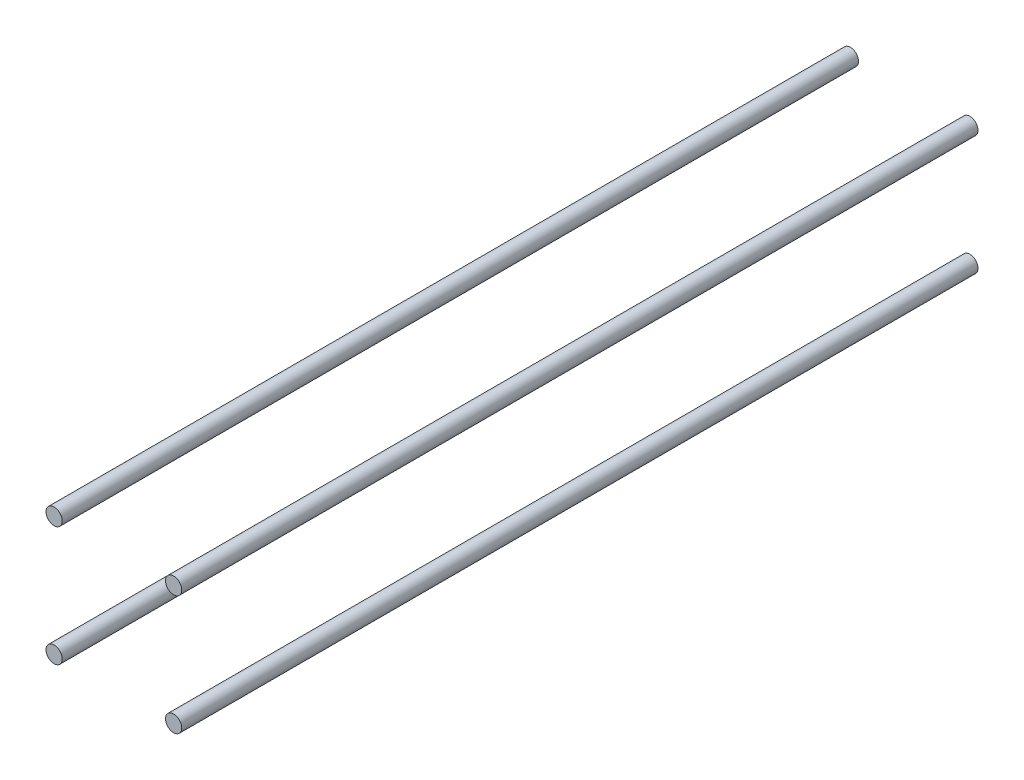
ISO-10303-21;
HEADER;
FILE_DESCRIPTION(('STEP AP214'),'2;1');
FILE_NAME('part.step','',(''),(''),'','','');
FILE_SCHEMA(('AUTOMOTIVE_DESIGN { 1 0 10303 214 1 1 1 1 }'));
ENDSEC;
DATA;
#1=APPLICATION_CONTEXT('core data for automotive mechanical design processes');
#2=APPLICATION_PROTOCOL_DEFINITION('international standard','automotive_design',2000,#1);
#3=PRODUCT_CONTEXT('',#1,'mechanical');
#4=PRODUCT('Part','Part','',(#3));
#5=PRODUCT_RELATED_PRODUCT_CATEGORY('part','',(#4));
#6=PRODUCT_DEFINITION_FORMATION('','',#4);
#7=PRODUCT_DEFINITION_CONTEXT('part definition',#1,'design');
#8=PRODUCT_DEFINITION('design','',#6,#7);
#9=PRODUCT_DEFINITION_SHAPE('','',#8);
#10=(LENGTH_UNIT() NAMED_UNIT(*) SI_UNIT(.MILLI.,.METRE.));
#11=(NAMED_UNIT(*) PLANE_ANGLE_UNIT() SI_UNIT($,.RADIAN.));
#12=(NAMED_UNIT(*) SI_UNIT($,.STERADIAN.) SOLID_ANGLE_UNIT());
#13=UNCERTAINTY_MEASURE_WITH_UNIT(LENGTH_MEASURE(1.E-05),#10,'distance_accuracy_value','');
#14=(GEOMETRIC_REPRESENTATION_CONTEXT(3) GLOBAL_UNCERTAINTY_ASSIGNED_CONTEXT((#13)) GLOBAL_UNIT_ASSIGNED_CONTEXT((#10,
#11,#12)) REPRESENTATION_CONTEXT('',''));
#15=CARTESIAN_POINT('',(0.,0.,0.));
#16=DIRECTION('',(0.,0.,1.));
#17=DIRECTION('',(1.,0.,0.));
#18=AXIS2_PLACEMENT_3D('',#15,#16,#17);
#19=CARTESIAN_POINT('',(-18.383354245955,18.3833542459555,245.));
#20=DIRECTION('',(0.,0.,-1.));
#21=DIRECTION('',(-1.,0.,0.));
#22=AXIS2_PLACEMENT_3D('',#19,#20,#21);
#23=CYLINDRICAL_SURFACE('',#22,2.5);
#24=CARTESIAN_POINT('',(-18.383354245955,18.3833542459555,245.));
#25=DIRECTION('',(0.,0.,1.));
#26=DIRECTION('',(1.,0.,0.));
#27=AXIS2_PLACEMENT_3D('',#24,#25,#26);
#28=CIRCLE('',#27,2.5);
#29=CARTESIAN_POINT('',(-15.883354245955,18.3833542459555,245.));
#30=VERTEX_POINT('',#29);
#31=EDGE_CURVE('E11',#30,#30,#28,.T.);
#32=ORIENTED_EDGE('',*,*,#31,.F.);
#33=EDGE_LOOP('',(#32));
#34=FACE_BOUND('',#33,.T.);
#35=CARTESIAN_POINT('',(-18.383354245955,18.3833542459555,0.));
#36=DIRECTION('',(0.,0.,1.));
#37=DIRECTION('',(1.,0.,0.));
#38=AXIS2_PLACEMENT_3D('',#35,#36,#37);
#39=CIRCLE('',#38,2.5);
#40=CARTESIAN_POINT('',(-15.883354245955,18.3833542459555,0.));
#41=VERTEX_POINT('',#40);
#42=EDGE_CURVE('E40',#41,#41,#39,.T.);
#43=ORIENTED_EDGE('',*,*,#42,.T.);
#44=EDGE_LOOP('',(#43));
#45=FACE_BOUND('',#44,.T.);
#46=ADVANCED_FACE('F37',(#34,#45),#23,.T.);
#47=CARTESIAN_POINT('',(-18.383354245955,18.3833542459555,245.));
#48=DIRECTION('',(0.,0.,1.));
#49=DIRECTION('',(1.,0.,0.));
#50=AXIS2_PLACEMENT_3D('',#47,#48,#49);
#51=PLANE('',#50);
#52=ORIENTED_EDGE('',*,*,#31,.T.);
#53=EDGE_LOOP('',(#52));
#54=FACE_BOUND('',#53,.T.);
#55=ADVANCED_FACE('F52',(#54),#51,.T.);
#56=CARTESIAN_POINT('',(-18.383354245955,18.3833542459555,0.));
#57=DIRECTION('',(0.,0.,1.));
#58=DIRECTION('',(1.,0.,0.));
#59=AXIS2_PLACEMENT_3D('',#56,#57,#58);
#60=PLANE('',#59);
#61=ORIENTED_EDGE('',*,*,#42,.F.);
#62=EDGE_LOOP('',(#61));
#63=FACE_BOUND('',#62,.T.);
#64=ADVANCED_FACE('F50',(#63),#60,.F.);
#65=CLOSED_SHELL('',(#46,#55,#64));
#66=MANIFOLD_SOLID_BREP('B2',#65);
#67=CARTESIAN_POINT('',(-18.3833542459554,-18.3833542459551,245.));
#68=DIRECTION('',(0.,0.,-1.));
#69=DIRECTION('',(-1.,0.,0.));
#70=AXIS2_PLACEMENT_3D('',#67,#68,#69);
#71=CYLINDRICAL_SURFACE('',#70,2.5);
#72=CARTESIAN_POINT('',(-18.3833542459554,-18.3833542459551,245.));
#73=DIRECTION('',(0.,0.,1.));
#74=DIRECTION('',(1.,0.,0.));
#75=AXIS2_PLACEMENT_3D('',#72,#73,#74);
#76=CIRCLE('',#75,2.5);
#77=CARTESIAN_POINT('',(-15.8833542459554,-18.3833542459551,245.));
#78=VERTEX_POINT('',#77);
#79=EDGE_CURVE('E36',#78,#78,#76,.T.);
#80=ORIENTED_EDGE('',*,*,#79,.F.);
#81=EDGE_LOOP('',(#80));
#82=FACE_BOUND('',#81,.T.);
#83=CARTESIAN_POINT('',(-18.3833542459554,-18.3833542459551,0.));
#84=DIRECTION('',(0.,0.,1.));
#85=DIRECTION('',(1.,0.,0.));
#86=AXIS2_PLACEMENT_3D('',#83,#84,#85);
#87=CIRCLE('',#86,2.5);
#88=CARTESIAN_POINT('',(-15.8833542459554,-18.3833542459551,0.));
#89=VERTEX_POINT('',#88);
#90=EDGE_CURVE('E88',#89,#89,#87,.T.);
#91=ORIENTED_EDGE('',*,*,#90,.T.);
#92=EDGE_LOOP('',(#91));
#93=FACE_BOUND('',#92,.T.);
#94=ADVANCED_FACE('F85',(#82,#93),#71,.T.);
#95=CARTESIAN_POINT('',(-18.3833542459554,-18.3833542459551,245.));
#96=DIRECTION('',(0.,0.,1.));
#97=DIRECTION('',(1.,0.,0.));
#98=AXIS2_PLACEMENT_3D('',#95,#96,#97);
#99=PLANE('',#98);
#100=ORIENTED_EDGE('',*,*,#79,.T.);
#101=EDGE_LOOP('',(#100));
#102=FACE_BOUND('',#101,.T.);
#103=ADVANCED_FACE('F100',(#102),#99,.T.);
#104=CARTESIAN_POINT('',(-18.3833542459554,-18.3833542459551,0.));
#105=DIRECTION('',(0.,0.,1.));
#106=DIRECTION('',(1.,0.,0.));
#107=AXIS2_PLACEMENT_3D('',#104,#105,#106);
#108=PLANE('',#107);
#109=ORIENTED_EDGE('',*,*,#90,.F.);
#110=EDGE_LOOP('',(#109));
#111=FACE_BOUND('',#110,.T.);
#112=ADVANCED_FACE('F98',(#111),#108,.F.);
#113=CLOSED_SHELL('',(#94,#103,#112));
#114=MANIFOLD_SOLID_BREP('B6',#113);
#115=CARTESIAN_POINT('',(18.3833542459552,-18.3833542459554,245.));
#116=DIRECTION('',(0.,0.,-1.));
#117=DIRECTION('',(-1.,0.,0.));
#118=AXIS2_PLACEMENT_3D('',#115,#116,#117);
#119=CYLINDRICAL_SURFACE('',#118,2.5);
#120=CARTESIAN_POINT('',(18.3833542459552,-18.3833542459554,245.));
#121=DIRECTION('',(0.,0.,1.));
#122=DIRECTION('',(1.,0.,0.));
#123=AXIS2_PLACEMENT_3D('',#120,#121,#122);
#124=CIRCLE('',#123,2.5);
#125=CARTESIAN_POINT('',(20.8833542459552,-18.3833542459554,245.));
#126=VERTEX_POINT('',#125);
#127=EDGE_CURVE('E84',#126,#126,#124,.T.);
#128=ORIENTED_EDGE('',*,*,#127,.F.);
#129=EDGE_LOOP('',(#128));
#130=FACE_BOUND('',#129,.T.);
#131=CARTESIAN_POINT('',(18.3833542459552,-18.3833542459554,0.));
#132=DIRECTION('',(0.,0.,1.));
#133=DIRECTION('',(1.,0.,0.));
#134=AXIS2_PLACEMENT_3D('',#131,#132,#133);
#135=CIRCLE('',#134,2.5);
#136=CARTESIAN_POINT('',(20.8833542459552,-18.3833542459554,0.));
#137=VERTEX_POINT('',#136);
#138=EDGE_CURVE('E135',#137,#137,#135,.T.);
#139=ORIENTED_EDGE('',*,*,#138,.T.);
#140=EDGE_LOOP('',(#139));
#141=FACE_BOUND('',#140,.T.);
#142=ADVANCED_FACE('F132',(#130,#141),#119,.T.);
#143=CARTESIAN_POINT('',(18.3833542459552,-18.3833542459554,245.));
#144=DIRECTION('',(0.,0.,1.));
#145=DIRECTION('',(1.,0.,0.));
#146=AXIS2_PLACEMENT_3D('',#143,#144,#145);
#147=PLANE('',#146);
#148=ORIENTED_EDGE('',*,*,#127,.T.);
#149=EDGE_LOOP('',(#148));
#150=FACE_BOUND('',#149,.T.);
#151=ADVANCED_FACE('F147',(#150),#147,.T.);
#152=CARTESIAN_POINT('',(18.3833542459552,-18.3833542459554,0.));
#153=DIRECTION('',(0.,0.,1.));
#154=DIRECTION('',(1.,0.,0.));
#155=AXIS2_PLACEMENT_3D('',#152,#153,#154);
#156=PLANE('',#155);
#157=ORIENTED_EDGE('',*,*,#138,.F.);
#158=EDGE_LOOP('',(#157));
#159=FACE_BOUND('',#158,.T.);
#160=ADVANCED_FACE('F145',(#159),#156,.F.);
#161=CLOSED_SHELL('',(#142,#151,#160));
#162=MANIFOLD_SOLID_BREP('B31',#161);
#163=CARTESIAN_POINT('',(18.3833542459553,18.3833542459552,245.));
#164=DIRECTION('',(0.,0.,-1.));
#165=DIRECTION('',(-1.,0.,0.));
#166=AXIS2_PLACEMENT_3D('',#163,#164,#165);
#167=CYLINDRICAL_SURFACE('',#166,2.5);
#168=CARTESIAN_POINT('',(18.3833542459553,18.3833542459552,245.));
#169=DIRECTION('',(0.,0.,1.));
#170=DIRECTION('',(1.,0.,0.));
#171=AXIS2_PLACEMENT_3D('',#168,#169,#170);
#172=CIRCLE('',#171,2.5);
#173=CARTESIAN_POINT('',(20.8833542459553,18.3833542459552,245.));
#174=VERTEX_POINT('',#173);
#175=EDGE_CURVE('E131',#174,#174,#172,.T.);
#176=ORIENTED_EDGE('',*,*,#175,.F.);
#177=EDGE_LOOP('',(#176));
#178=FACE_BOUND('',#177,.T.);
#179=CARTESIAN_POINT('',(18.3833542459553,18.3833542459552,0.));
#180=DIRECTION('',(0.,0.,1.));
#181=DIRECTION('',(1.,0.,0.));
#182=AXIS2_PLACEMENT_3D('',#179,#180,#181);
#183=CIRCLE('',#182,2.5);
#184=CARTESIAN_POINT('',(20.8833542459553,18.3833542459552,0.));
#185=VERTEX_POINT('',#184);
#186=EDGE_CURVE('E175',#185,#185,#183,.T.);
#187=ORIENTED_EDGE('',*,*,#186,.T.);
#188=EDGE_LOOP('',(#187));
#189=FACE_BOUND('',#188,.T.);
#190=ADVANCED_FACE('F172',(#178,#189),#167,.T.);
#191=CARTESIAN_POINT('',(18.3833542459553,18.3833542459552,245.));
#192=DIRECTION('',(0.,0.,1.));
#193=DIRECTION('',(1.,0.,0.));
#194=AXIS2_PLACEMENT_3D('',#191,#192,#193);
#195=PLANE('',#194);
#196=ORIENTED_EDGE('',*,*,#175,.T.);
#197=EDGE_LOOP('',(#196));
#198=FACE_BOUND('',#197,.T.);
#199=ADVANCED_FACE('F187',(#198),#195,.T.);
#200=CARTESIAN_POINT('',(18.3833542459553,18.3833542459552,0.));
#201=DIRECTION('',(0.,0.,1.));
#202=DIRECTION('',(1.,0.,0.));
#203=AXIS2_PLACEMENT_3D('',#200,#201,#202);
#204=PLANE('',#203);
#205=ORIENTED_EDGE('',*,*,#186,.F.);
#206=EDGE_LOOP('',(#205));
#207=FACE_BOUND('',#206,.T.);
#208=ADVANCED_FACE('F185',(#207),#204,.F.);
#209=CLOSED_SHELL('',(#190,#199,#208));
#210=MANIFOLD_SOLID_BREP('B79',#209);
#211=ADVANCED_BREP_SHAPE_REPRESENTATION('',(#18,#66,#114,#162,#210),#14);
#212=SHAPE_DEFINITION_REPRESENTATION(#9,#211);
ENDSEC;
END-ISO-10303-21;
